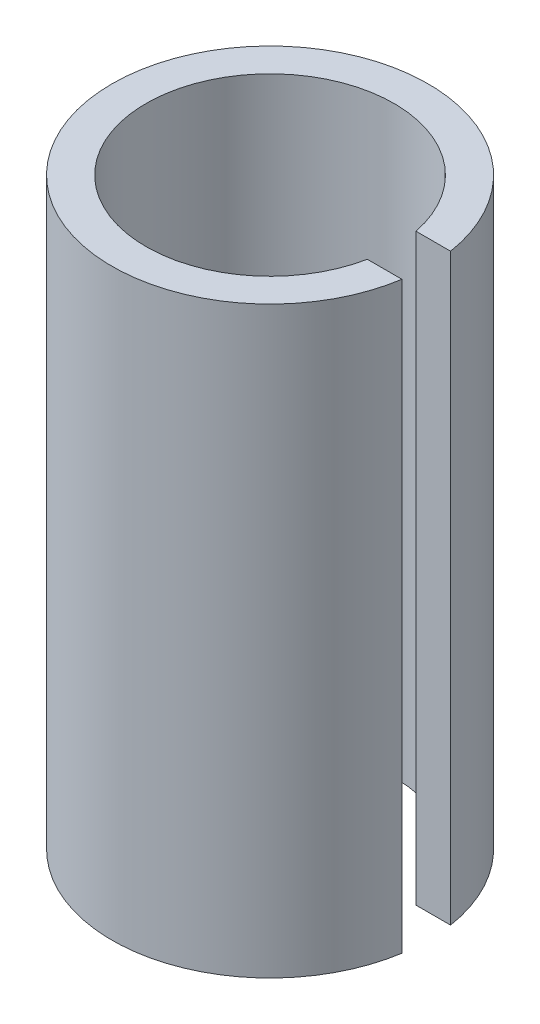
ISO-10303-21;
HEADER;
FILE_DESCRIPTION(('STEP AP214'),'2;1');
FILE_NAME('part.step','',(''),(''),'','','');
FILE_SCHEMA(('AUTOMOTIVE_DESIGN { 1 0 10303 214 1 1 1 1 }'));
ENDSEC;
DATA;
#1=APPLICATION_CONTEXT('core data for automotive mechanical design processes');
#2=APPLICATION_PROTOCOL_DEFINITION('international standard','automotive_design',2000,#1);
#3=PRODUCT_CONTEXT('',#1,'mechanical');
#4=PRODUCT('Part','Part','',(#3));
#5=PRODUCT_RELATED_PRODUCT_CATEGORY('part','',(#4));
#6=PRODUCT_DEFINITION_FORMATION('','',#4);
#7=PRODUCT_DEFINITION_CONTEXT('part definition',#1,'design');
#8=PRODUCT_DEFINITION('design','',#6,#7);
#9=PRODUCT_DEFINITION_SHAPE('','',#8);
#10=(LENGTH_UNIT() NAMED_UNIT(*) SI_UNIT(.MILLI.,.METRE.));
#11=(NAMED_UNIT(*) PLANE_ANGLE_UNIT() SI_UNIT($,.RADIAN.));
#12=(NAMED_UNIT(*) SI_UNIT($,.STERADIAN.) SOLID_ANGLE_UNIT());
#13=UNCERTAINTY_MEASURE_WITH_UNIT(LENGTH_MEASURE(1.E-05),#10,'distance_accuracy_value','');
#14=(GEOMETRIC_REPRESENTATION_CONTEXT(3) GLOBAL_UNCERTAINTY_ASSIGNED_CONTEXT((#13)) GLOBAL_UNIT_ASSIGNED_CONTEXT((#10,
#11,#12)) REPRESENTATION_CONTEXT('',''));
#15=CARTESIAN_POINT('',(0.,0.,0.));
#16=DIRECTION('',(0.,0.,1.));
#17=DIRECTION('',(1.,0.,0.));
#18=AXIS2_PLACEMENT_3D('',#15,#16,#17);
#19=CARTESIAN_POINT('',(0.,12.,0.));
#20=DIRECTION('',(0.,-1.,0.));
#21=DIRECTION('',(0.,0.,-1.));
#22=AXIS2_PLACEMENT_3D('',#19,#20,#21);
#23=CYLINDRICAL_SURFACE('',#22,2.55);
#24=CARTESIAN_POINT('',(0.,0.,0.));
#25=DIRECTION('',(0.,1.,0.));
#26=DIRECTION('',(0.,0.,1.));
#27=AXIS2_PLACEMENT_3D('',#24,#25,#26);
#28=CIRCLE('',#27,2.55);
#29=CARTESIAN_POINT('',(2.50049995001,0.,-0.5));
#30=VERTEX_POINT('',#29);
#31=CARTESIAN_POINT('',(2.50049995001,0.,0.5));
#32=VERTEX_POINT('',#31);
#33=EDGE_CURVE('E103',#30,#32,#28,.T.);
#34=ORIENTED_EDGE('',*,*,#33,.F.);
#35=DIRECTION('',(0.,-1.,0.));
#36=VECTOR('',#35,1.);
#37=CARTESIAN_POINT('',(2.50049995001,12.,-0.5));
#38=LINE('',#37,#36);
#39=CARTESIAN_POINT('',(2.50049995001,12.,-0.5));
#40=VERTEX_POINT('',#39);
#41=EDGE_CURVE('E11',#40,#30,#38,.T.);
#42=ORIENTED_EDGE('',*,*,#41,.F.);
#43=CARTESIAN_POINT('',(0.,12.,0.));
#44=DIRECTION('',(0.,1.,0.));
#45=DIRECTION('',(0.,0.,1.));
#46=AXIS2_PLACEMENT_3D('',#43,#44,#45);
#47=CIRCLE('',#46,2.55);
#48=CARTESIAN_POINT('',(2.50049995001,12.,0.5));
#49=VERTEX_POINT('',#48);
#50=EDGE_CURVE('E88',#40,#49,#47,.T.);
#51=ORIENTED_EDGE('',*,*,#50,.T.);
#52=DIRECTION('',(0.,-1.,0.));
#53=VECTOR('',#52,1.);
#54=CARTESIAN_POINT('',(2.50049995001,12.,0.5));
#55=LINE('',#54,#53);
#56=EDGE_CURVE('E56',#49,#32,#55,.T.);
#57=ORIENTED_EDGE('',*,*,#56,.T.);
#58=EDGE_LOOP('',(#34,#42,#51,#57));
#59=FACE_BOUND('',#58,.T.);
#60=ADVANCED_FACE('F40',(#59),#23,.F.);
#61=CARTESIAN_POINT('',(0.,12.,-0.5));
#62=DIRECTION('',(0.,0.,-1.));
#63=DIRECTION('',(-1.,0.,0.));
#64=AXIS2_PLACEMENT_3D('',#61,#62,#63);
#65=PLANE('',#64);
#66=DIRECTION('',(1.,0.,0.));
#67=VECTOR('',#66,1.);
#68=CARTESIAN_POINT('',(0.,0.,-0.5));
#69=LINE('',#68,#67);
#70=CARTESIAN_POINT('',(3.21130814466628,0.,-0.5));
#71=VERTEX_POINT('',#70);
#72=EDGE_CURVE('E94',#30,#71,#69,.T.);
#73=ORIENTED_EDGE('',*,*,#72,.T.);
#74=DIRECTION('',(0.,-1.,0.));
#75=VECTOR('',#74,1.);
#76=CARTESIAN_POINT('',(3.21130814466628,12.,-0.5));
#77=LINE('',#76,#75);
#78=CARTESIAN_POINT('',(3.21130814466628,12.,-0.5));
#79=VERTEX_POINT('',#78);
#80=EDGE_CURVE('E48',#79,#71,#77,.T.);
#81=ORIENTED_EDGE('',*,*,#80,.F.);
#82=DIRECTION('',(1.,0.,0.));
#83=VECTOR('',#82,1.);
#84=CARTESIAN_POINT('',(0.,12.,-0.5));
#85=LINE('',#84,#83);
#86=EDGE_CURVE('E82',#40,#79,#85,.T.);
#87=ORIENTED_EDGE('',*,*,#86,.F.);
#88=ORIENTED_EDGE('',*,*,#41,.T.);
#89=EDGE_LOOP('',(#73,#81,#87,#88));
#90=FACE_BOUND('',#89,.T.);
#91=ADVANCED_FACE('F92',(#90),#65,.F.);
#92=CARTESIAN_POINT('',(0.,12.,0.));
#93=DIRECTION('',(0.,-1.,0.));
#94=DIRECTION('',(0.,0.,-1.));
#95=AXIS2_PLACEMENT_3D('',#92,#93,#94);
#96=CYLINDRICAL_SURFACE('',#95,3.25);
#97=CARTESIAN_POINT('',(0.,0.,0.));
#98=DIRECTION('',(0.,1.,0.));
#99=DIRECTION('',(0.,0.,1.));
#100=AXIS2_PLACEMENT_3D('',#97,#98,#99);
#101=CIRCLE('',#100,3.25);
#102=CARTESIAN_POINT('',(3.21130814466628,0.,0.5));
#103=VERTEX_POINT('',#102);
#104=EDGE_CURVE('E106',#71,#103,#101,.T.);
#105=ORIENTED_EDGE('',*,*,#104,.T.);
#106=DIRECTION('',(0.,-1.,0.));
#107=VECTOR('',#106,1.);
#108=CARTESIAN_POINT('',(3.21130814466628,12.,0.5));
#109=LINE('',#108,#107);
#110=CARTESIAN_POINT('',(3.21130814466628,12.,0.5));
#111=VERTEX_POINT('',#110);
#112=EDGE_CURVE('E70',#111,#103,#109,.T.);
#113=ORIENTED_EDGE('',*,*,#112,.F.);
#114=CARTESIAN_POINT('',(0.,12.,0.));
#115=DIRECTION('',(0.,1.,0.));
#116=DIRECTION('',(0.,0.,1.));
#117=AXIS2_PLACEMENT_3D('',#114,#115,#116);
#118=CIRCLE('',#117,3.25);
#119=EDGE_CURVE('E87',#79,#111,#118,.T.);
#120=ORIENTED_EDGE('',*,*,#119,.F.);
#121=ORIENTED_EDGE('',*,*,#80,.T.);
#122=EDGE_LOOP('',(#105,#113,#120,#121));
#123=FACE_BOUND('',#122,.T.);
#124=ADVANCED_FACE('F97',(#123),#96,.T.);
#125=CARTESIAN_POINT('',(0.,12.,0.5));
#126=DIRECTION('',(0.,0.,-1.));
#127=DIRECTION('',(-1.,0.,0.));
#128=AXIS2_PLACEMENT_3D('',#125,#126,#127);
#129=PLANE('',#128);
#130=DIRECTION('',(1.,0.,0.));
#131=VECTOR('',#130,1.);
#132=CARTESIAN_POINT('',(0.,0.,0.5));
#133=LINE('',#132,#131);
#134=EDGE_CURVE('E108',#32,#103,#133,.T.);
#135=ORIENTED_EDGE('',*,*,#134,.F.);
#136=ORIENTED_EDGE('',*,*,#56,.F.);
#137=DIRECTION('',(1.,0.,0.));
#138=VECTOR('',#137,1.);
#139=CARTESIAN_POINT('',(0.,12.,0.5));
#140=LINE('',#139,#138);
#141=EDGE_CURVE('E98',#49,#111,#140,.T.);
#142=ORIENTED_EDGE('',*,*,#141,.T.);
#143=ORIENTED_EDGE('',*,*,#112,.T.);
#144=EDGE_LOOP('',(#135,#136,#142,#143));
#145=FACE_BOUND('',#144,.T.);
#146=ADVANCED_FACE('F113',(#145),#129,.T.);
#147=CARTESIAN_POINT('',(0.,12.,0.));
#148=DIRECTION('',(0.,1.,0.));
#149=DIRECTION('',(0.,0.,1.));
#150=AXIS2_PLACEMENT_3D('',#147,#148,#149);
#151=PLANE('',#150);
#152=ORIENTED_EDGE('',*,*,#50,.F.);
#153=ORIENTED_EDGE('',*,*,#86,.T.);
#154=ORIENTED_EDGE('',*,*,#119,.T.);
#155=ORIENTED_EDGE('',*,*,#141,.F.);
#156=EDGE_LOOP('',(#152,#153,#154,#155));
#157=FACE_BOUND('',#156,.T.);
#158=ADVANCED_FACE('F84',(#157),#151,.T.);
#159=CARTESIAN_POINT('',(0.,0.,0.));
#160=DIRECTION('',(0.,1.,0.));
#161=DIRECTION('',(0.,0.,1.));
#162=AXIS2_PLACEMENT_3D('',#159,#160,#161);
#163=PLANE('',#162);
#164=ORIENTED_EDGE('',*,*,#33,.T.);
#165=ORIENTED_EDGE('',*,*,#134,.T.);
#166=ORIENTED_EDGE('',*,*,#104,.F.);
#167=ORIENTED_EDGE('',*,*,#72,.F.);
#168=EDGE_LOOP('',(#164,#165,#166,#167));
#169=FACE_BOUND('',#168,.T.);
#170=ADVANCED_FACE('F120',(#169),#163,.F.);
#171=CLOSED_SHELL('',(#60,#91,#124,#146,#158,#170));
#172=MANIFOLD_SOLID_BREP('B2',#171);
#173=ADVANCED_BREP_SHAPE_REPRESENTATION('',(#18,#172),#14);
#174=SHAPE_DEFINITION_REPRESENTATION(#9,#173);
ENDSEC;
END-ISO-10303-21;
